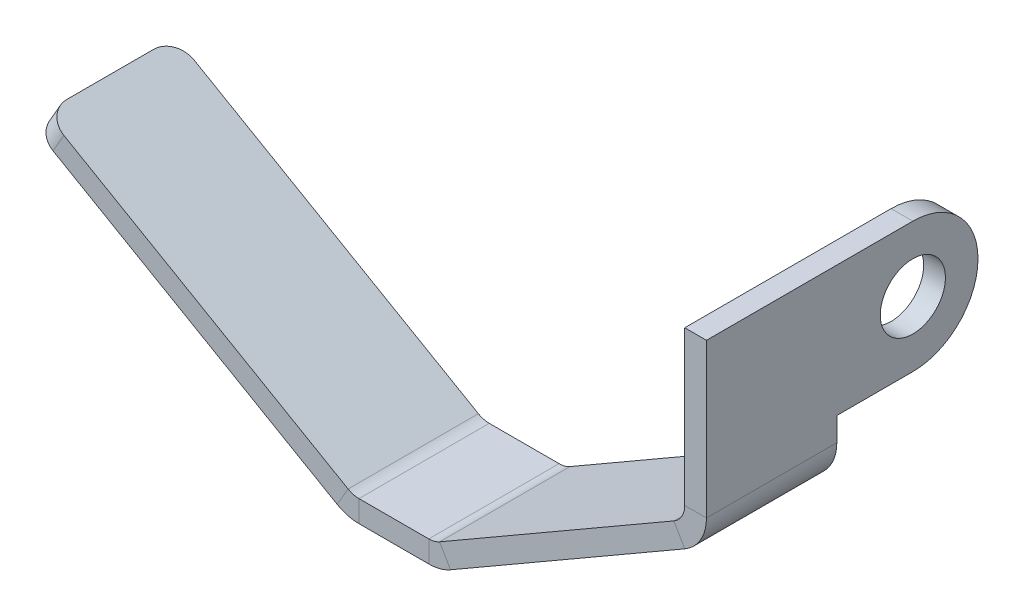
ISO-10303-21;
HEADER;
FILE_DESCRIPTION(('STEP AP214'),'2;1');
FILE_NAME('part.step','',(''),(''),'','','');
FILE_SCHEMA(('AUTOMOTIVE_DESIGN { 1 0 10303 214 1 1 1 1 }'));
ENDSEC;
DATA;
#1=APPLICATION_CONTEXT('core data for automotive mechanical design processes');
#2=APPLICATION_PROTOCOL_DEFINITION('international standard','automotive_design',2000,#1);
#3=PRODUCT_CONTEXT('',#1,'mechanical');
#4=PRODUCT('Part','Part','',(#3));
#5=PRODUCT_RELATED_PRODUCT_CATEGORY('part','',(#4));
#6=PRODUCT_DEFINITION_FORMATION('','',#4);
#7=PRODUCT_DEFINITION_CONTEXT('part definition',#1,'design');
#8=PRODUCT_DEFINITION('design','',#6,#7);
#9=PRODUCT_DEFINITION_SHAPE('','',#8);
#10=(LENGTH_UNIT() NAMED_UNIT(*) SI_UNIT(.MILLI.,.METRE.));
#11=(NAMED_UNIT(*) PLANE_ANGLE_UNIT() SI_UNIT($,.RADIAN.));
#12=(NAMED_UNIT(*) SI_UNIT($,.STERADIAN.) SOLID_ANGLE_UNIT());
#13=UNCERTAINTY_MEASURE_WITH_UNIT(LENGTH_MEASURE(1.E-05),#10,'distance_accuracy_value','');
#14=(GEOMETRIC_REPRESENTATION_CONTEXT(3) GLOBAL_UNCERTAINTY_ASSIGNED_CONTEXT((#13)) GLOBAL_UNIT_ASSIGNED_CONTEXT((#10,
#11,#12)) REPRESENTATION_CONTEXT('',''));
#15=CARTESIAN_POINT('',(0.,0.,0.));
#16=DIRECTION('',(0.,0.,1.));
#17=DIRECTION('',(1.,0.,0.));
#18=AXIS2_PLACEMENT_3D('',#15,#16,#17);
#19=CARTESIAN_POINT('',(0.303111922369607,-1.0623749446338,-6.));
#20=DIRECTION('',(0.,0.,-1.));
#21=DIRECTION('',(-0.866025403784438,-0.500000000000001,0.));
#22=AXIS2_PLACEMENT_3D('',#19,#20,#21);
#23=PLANE('',#22);
#24=DIRECTION('',(0.866025403784438,0.500000000000001,0.));
#25=VECTOR('',#24,1.);
#26=CARTESIAN_POINT('',(0.303111922369607,-1.0623749446338,-6.));
#27=LINE('',#26,#25);
#28=CARTESIAN_POINT('',(4.10730091830127,1.13397459621556,-6.));
#29=VERTEX_POINT('',#28);
#30=CARTESIAN_POINT('',(14.8915691904895,7.36027478617659,-6.));
#31=VERTEX_POINT('',#30);
#32=EDGE_CURVE('E267',#29,#31,#27,.T.);
#33=ORIENTED_EDGE('',*,*,#32,.T.);
#34=DIRECTION('',(0.500000000000001,-0.866025403784438,0.));
#35=VECTOR('',#34,1.);
#36=CARTESIAN_POINT('',(14.8915691904895,7.36027478617659,-6.));
#37=LINE('',#36,#35);
#38=CARTESIAN_POINT('',(15.3915691904895,6.49424938239215,-6.));
#39=VERTEX_POINT('',#38);
#40=EDGE_CURVE('E12',#31,#39,#37,.T.);
#41=ORIENTED_EDGE('',*,*,#40,.T.);
#42=DIRECTION('',(0.866025403784438,0.500000000000001,0.));
#43=VECTOR('',#42,1.);
#44=CARTESIAN_POINT('',(0.803111922369608,-1.92840034841824,-6.));
#45=LINE('',#44,#43);
#46=CARTESIAN_POINT('',(4.60730091830128,0.267949192431124,-6.));
#47=VERTEX_POINT('',#46);
#48=EDGE_CURVE('E248',#47,#39,#45,.T.);
#49=ORIENTED_EDGE('',*,*,#48,.F.);
#50=DIRECTION('',(0.500000000000001,-0.866025403784438,0.));
#51=VECTOR('',#50,1.);
#52=CARTESIAN_POINT('',(4.10730091830127,1.13397459621556,-6.));
#53=LINE('',#52,#51);
#54=EDGE_CURVE('E253',#29,#47,#53,.T.);
#55=ORIENTED_EDGE('',*,*,#54,.F.);
#56=EDGE_LOOP('',(#33,#41,#49,#55));
#57=FACE_BOUND('',#56,.T.);
#58=ADVANCED_FACE('F58',(#57),#23,.T.);
#59=CARTESIAN_POINT('',(0.303111922369607,-1.0623749446338,0.));
#60=DIRECTION('',(-0.500000000000001,0.866025403784438,0.));
#61=DIRECTION('',(0.,0.,1.));
#62=AXIS2_PLACEMENT_3D('',#59,#60,#61);
#63=PLANE('',#62);
#64=DIRECTION('',(0.866025403784438,0.500000000000001,0.));
#65=VECTOR('',#64,1.);
#66=CARTESIAN_POINT('',(0.303111922369607,-1.0623749446338,0.));
#67=LINE('',#66,#65);
#68=CARTESIAN_POINT('',(4.10730091830127,1.13397459621556,0.));
#69=VERTEX_POINT('',#68);
#70=CARTESIAN_POINT('',(14.8915691904895,7.36027478617659,0.));
#71=VERTEX_POINT('',#70);
#72=EDGE_CURVE('E61',#69,#71,#67,.T.);
#73=ORIENTED_EDGE('',*,*,#72,.T.);
#74=DIRECTION('',(0.,0.,-1.));
#75=VECTOR('',#74,1.);
#76=CARTESIAN_POINT('',(14.8915691904895,7.36027478617659,0.));
#77=LINE('',#76,#75);
#78=EDGE_CURVE('E345',#71,#31,#77,.T.);
#79=ORIENTED_EDGE('',*,*,#78,.T.);
#80=ORIENTED_EDGE('',*,*,#32,.F.);
#81=DIRECTION('',(0.,0.,-1.));
#82=VECTOR('',#81,1.);
#83=CARTESIAN_POINT('',(4.10730091830127,1.13397459621556,0.));
#84=LINE('',#83,#82);
#85=EDGE_CURVE('E241',#69,#29,#84,.T.);
#86=ORIENTED_EDGE('',*,*,#85,.F.);
#87=EDGE_LOOP('',(#73,#79,#80,#86));
#88=FACE_BOUND('',#87,.T.);
#89=ADVANCED_FACE('F383',(#88),#63,.T.);
#90=CARTESIAN_POINT('',(0.,1.,-6.));
#91=DIRECTION('',(0.,0.,-1.));
#92=DIRECTION('',(-1.,0.,0.));
#93=AXIS2_PLACEMENT_3D('',#90,#91,#92);
#94=PLANE('',#93);
#95=DIRECTION('',(1.,0.,0.));
#96=VECTOR('',#95,1.);
#97=CARTESIAN_POINT('',(0.,1.,-6.));
#98=LINE('',#97,#96);
#99=CARTESIAN_POINT('',(0.392699081698723,1.,-6.));
#100=VERTEX_POINT('',#99);
#101=CARTESIAN_POINT('',(3.60730091830127,1.,-6.));
#102=VERTEX_POINT('',#101);
#103=EDGE_CURVE('E346',#100,#102,#98,.T.);
#104=ORIENTED_EDGE('',*,*,#103,.T.);
#105=DIRECTION('',(0.,-1.,0.));
#106=VECTOR('',#105,1.);
#107=CARTESIAN_POINT('',(3.60730091830127,1.,-6.));
#108=LINE('',#107,#106);
#109=CARTESIAN_POINT('',(3.60730091830127,0.,-6.));
#110=VERTEX_POINT('',#109);
#111=EDGE_CURVE('E342',#102,#110,#108,.T.);
#112=ORIENTED_EDGE('',*,*,#111,.T.);
#113=DIRECTION('',(1.,0.,0.));
#114=VECTOR('',#113,1.);
#115=CARTESIAN_POINT('',(0.,0.,-6.));
#116=LINE('',#115,#114);
#117=CARTESIAN_POINT('',(0.392699081698723,0.,-6.));
#118=VERTEX_POINT('',#117);
#119=EDGE_CURVE('E320',#118,#110,#116,.T.);
#120=ORIENTED_EDGE('',*,*,#119,.F.);
#121=DIRECTION('',(0.,-1.,0.));
#122=VECTOR('',#121,1.);
#123=CARTESIAN_POINT('',(0.392699081698723,1.,-6.));
#124=LINE('',#123,#122);
#125=EDGE_CURVE('E326',#100,#118,#124,.T.);
#126=ORIENTED_EDGE('',*,*,#125,.F.);
#127=EDGE_LOOP('',(#104,#112,#120,#126));
#128=FACE_BOUND('',#127,.T.);
#129=ADVANCED_FACE('F399',(#128),#94,.T.);
#130=CARTESIAN_POINT('',(0.,1.,0.));
#131=DIRECTION('',(0.,1.,0.));
#132=DIRECTION('',(0.,0.,1.));
#133=AXIS2_PLACEMENT_3D('',#130,#131,#132);
#134=PLANE('',#133);
#135=DIRECTION('',(1.,0.,0.));
#136=VECTOR('',#135,1.);
#137=CARTESIAN_POINT('',(0.,1.,0.));
#138=LINE('',#137,#136);
#139=CARTESIAN_POINT('',(0.392699081698723,1.,0.));
#140=VERTEX_POINT('',#139);
#141=CARTESIAN_POINT('',(3.60730091830127,1.,0.));
#142=VERTEX_POINT('',#141);
#143=EDGE_CURVE('E327',#140,#142,#138,.T.);
#144=ORIENTED_EDGE('',*,*,#143,.T.);
#145=DIRECTION('',(0.,0.,-1.));
#146=VECTOR('',#145,1.);
#147=CARTESIAN_POINT('',(3.60730091830127,1.,0.));
#148=LINE('',#147,#146);
#149=EDGE_CURVE('E335',#142,#102,#148,.T.);
#150=ORIENTED_EDGE('',*,*,#149,.T.);
#151=ORIENTED_EDGE('',*,*,#103,.F.);
#152=DIRECTION('',(0.,0.,-1.));
#153=VECTOR('',#152,1.);
#154=CARTESIAN_POINT('',(0.392699081698723,1.,0.));
#155=LINE('',#154,#153);
#156=EDGE_CURVE('E324',#140,#100,#155,.T.);
#157=ORIENTED_EDGE('',*,*,#156,.F.);
#158=EDGE_LOOP('',(#144,#150,#151,#157));
#159=FACE_BOUND('',#158,.T.);
#160=ADVANCED_FACE('F393',(#159),#134,.T.);
#161=CARTESIAN_POINT('',(0.,0.,0.));
#162=DIRECTION('',(0.,1.,0.));
#163=DIRECTION('',(0.,0.,1.));
#164=AXIS2_PLACEMENT_3D('',#161,#162,#163);
#165=PLANE('',#164);
#166=DIRECTION('',(0.,0.,-1.));
#167=VECTOR('',#166,1.);
#168=CARTESIAN_POINT('',(3.60730091830127,0.,0.));
#169=LINE('',#168,#167);
#170=CARTESIAN_POINT('',(3.60730091830127,0.,0.));
#171=VERTEX_POINT('',#170);
#172=EDGE_CURVE('E340',#171,#110,#169,.T.);
#173=ORIENTED_EDGE('',*,*,#172,.F.);
#174=DIRECTION('',(1.,0.,0.));
#175=VECTOR('',#174,1.);
#176=CARTESIAN_POINT('',(0.,0.,0.));
#177=LINE('',#176,#175);
#178=CARTESIAN_POINT('',(0.392699081698723,0.,0.));
#179=VERTEX_POINT('',#178);
#180=EDGE_CURVE('E349',#179,#171,#177,.T.);
#181=ORIENTED_EDGE('',*,*,#180,.F.);
#182=DIRECTION('',(0.,0.,-1.));
#183=VECTOR('',#182,1.);
#184=CARTESIAN_POINT('',(0.392699081698723,0.,0.));
#185=LINE('',#184,#183);
#186=EDGE_CURVE('E329',#179,#118,#185,.T.);
#187=ORIENTED_EDGE('',*,*,#186,.T.);
#188=ORIENTED_EDGE('',*,*,#119,.T.);
#189=EDGE_LOOP('',(#173,#181,#187,#188));
#190=FACE_BOUND('',#189,.T.);
#191=ADVANCED_FACE('F438',(#190),#165,.F.);
#192=CARTESIAN_POINT('',(0.,1.,0.));
#193=DIRECTION('',(0.,0.,-1.));
#194=DIRECTION('',(-1.,0.,0.));
#195=AXIS2_PLACEMENT_3D('',#192,#193,#194);
#196=PLANE('',#195);
#197=DIRECTION('',(0.,-1.,0.));
#198=VECTOR('',#197,1.);
#199=CARTESIAN_POINT('',(3.60730091830127,1.,0.));
#200=LINE('',#199,#198);
#201=EDGE_CURVE('E338',#142,#171,#200,.T.);
#202=ORIENTED_EDGE('',*,*,#201,.F.);
#203=ORIENTED_EDGE('',*,*,#143,.F.);
#204=DIRECTION('',(0.,-1.,0.));
#205=VECTOR('',#204,1.);
#206=CARTESIAN_POINT('',(0.392699081698723,1.,0.));
#207=LINE('',#206,#205);
#208=EDGE_CURVE('E332',#140,#179,#207,.T.);
#209=ORIENTED_EDGE('',*,*,#208,.T.);
#210=ORIENTED_EDGE('',*,*,#180,.T.);
#211=EDGE_LOOP('',(#202,#203,#209,#210));
#212=FACE_BOUND('',#211,.T.);
#213=ADVANCED_FACE('F433',(#212),#196,.F.);
#214=CARTESIAN_POINT('',(0.392699081698723,2.,0.));
#215=DIRECTION('',(0.,0.,-1.));
#216=DIRECTION('',(-1.,0.,0.));
#217=AXIS2_PLACEMENT_3D('',#214,#215,#216);
#218=PLANE('',#217);
#219=DIRECTION('',(-0.500000000000001,-0.866025403784438,0.));
#220=VECTOR('',#219,1.);
#221=CARTESIAN_POINT('',(-0.107300918301278,1.13397459621556,0.));
#222=LINE('',#221,#220);
#223=CARTESIAN_POINT('',(-0.107300918301278,1.13397459621556,0.));
#224=VERTEX_POINT('',#223);
#225=CARTESIAN_POINT('',(-0.607300918301279,0.267949192431124,0.));
#226=VERTEX_POINT('',#225);
#227=EDGE_CURVE('E263',#224,#226,#222,.T.);
#228=ORIENTED_EDGE('',*,*,#227,.T.);
#229=CARTESIAN_POINT('',(0.392699081698723,2.,0.));
#230=DIRECTION('',(0.,0.,1.));
#231=DIRECTION('',(1.,0.,0.));
#232=AXIS2_PLACEMENT_3D('',#229,#230,#231);
#233=CIRCLE('',#232,2.);
#234=EDGE_CURVE('E271',#226,#179,#233,.T.);
#235=ORIENTED_EDGE('',*,*,#234,.T.);
#236=ORIENTED_EDGE('',*,*,#208,.F.);
#237=CARTESIAN_POINT('',(0.392699081698723,2.,0.));
#238=DIRECTION('',(0.,0.,1.));
#239=DIRECTION('',(1.,0.,0.));
#240=AXIS2_PLACEMENT_3D('',#237,#238,#239);
#241=CIRCLE('',#240,1.);
#242=EDGE_CURVE('E313',#224,#140,#241,.T.);
#243=ORIENTED_EDGE('',*,*,#242,.F.);
#244=EDGE_LOOP('',(#228,#235,#236,#243));
#245=FACE_BOUND('',#244,.T.);
#246=ADVANCED_FACE('F420',(#245),#218,.F.);
#247=CARTESIAN_POINT('',(0.392699081698723,2.,-6.));
#248=DIRECTION('',(0.,0.,1.));
#249=DIRECTION('',(1.,0.,0.));
#250=AXIS2_PLACEMENT_3D('',#247,#248,#249);
#251=PLANE('',#250);
#252=CARTESIAN_POINT('',(0.392699081698723,2.,-6.));
#253=DIRECTION('',(0.,0.,1.));
#254=DIRECTION('',(1.,0.,0.));
#255=AXIS2_PLACEMENT_3D('',#252,#253,#254);
#256=CIRCLE('',#255,2.);
#257=CARTESIAN_POINT('',(-0.607300918301279,0.267949192431124,-6.));
#258=VERTEX_POINT('',#257);
#259=EDGE_CURVE('E317',#118,#258,#256,.F.);
#260=ORIENTED_EDGE('',*,*,#259,.T.);
#261=DIRECTION('',(-0.500000000000001,-0.866025403784438,0.));
#262=VECTOR('',#261,1.);
#263=CARTESIAN_POINT('',(-0.107300918301278,1.13397459621556,-6.));
#264=LINE('',#263,#262);
#265=CARTESIAN_POINT('',(-0.107300918301278,1.13397459621556,-6.));
#266=VERTEX_POINT('',#265);
#267=EDGE_CURVE('E277',#266,#258,#264,.T.);
#268=ORIENTED_EDGE('',*,*,#267,.F.);
#269=CARTESIAN_POINT('',(0.392699081698723,2.,-6.));
#270=DIRECTION('',(0.,0.,-1.));
#271=DIRECTION('',(1.,0.,0.));
#272=AXIS2_PLACEMENT_3D('',#269,#270,#271);
#273=CIRCLE('',#272,1.);
#274=EDGE_CURVE('E316',#100,#266,#273,.T.);
#275=ORIENTED_EDGE('',*,*,#274,.F.);
#276=ORIENTED_EDGE('',*,*,#125,.T.);
#277=EDGE_LOOP('',(#260,#268,#275,#276));
#278=FACE_BOUND('',#277,.T.);
#279=ADVANCED_FACE('F404',(#278),#251,.F.);
#280=CARTESIAN_POINT('',(0.392699081698723,2.,-9.13325772123332));
#281=DIRECTION('',(0.,0.,1.));
#282=DIRECTION('',(1.,0.,0.));
#283=AXIS2_PLACEMENT_3D('',#280,#281,#282);
#284=CYLINDRICAL_SURFACE('',#283,1.);
#285=ORIENTED_EDGE('',*,*,#156,.T.);
#286=ORIENTED_EDGE('',*,*,#274,.T.);
#287=DIRECTION('',(0.,0.,-1.));
#288=VECTOR('',#287,1.);
#289=CARTESIAN_POINT('',(-0.107300918301278,1.13397459621556,0.));
#290=LINE('',#289,#288);
#291=EDGE_CURVE('E289',#224,#266,#290,.T.);
#292=ORIENTED_EDGE('',*,*,#291,.F.);
#293=ORIENTED_EDGE('',*,*,#242,.T.);
#294=EDGE_LOOP('',(#285,#286,#292,#293));
#295=FACE_BOUND('',#294,.T.);
#296=ADVANCED_FACE('F431',(#295),#284,.F.);
#297=CARTESIAN_POINT('',(0.392699081698723,2.,-9.13325772123332));
#298=DIRECTION('',(0.,0.,1.));
#299=DIRECTION('',(1.,0.,0.));
#300=AXIS2_PLACEMENT_3D('',#297,#298,#299);
#301=CYLINDRICAL_SURFACE('',#300,2.);
#302=ORIENTED_EDGE('',*,*,#186,.F.);
#303=ORIENTED_EDGE('',*,*,#234,.F.);
#304=DIRECTION('',(0.,0.,-1.));
#305=VECTOR('',#304,1.);
#306=CARTESIAN_POINT('',(-0.607300918301279,0.267949192431124,0.));
#307=LINE('',#306,#305);
#308=EDGE_CURVE('E308',#226,#258,#307,.T.);
#309=ORIENTED_EDGE('',*,*,#308,.T.);
#310=ORIENTED_EDGE('',*,*,#259,.F.);
#311=EDGE_LOOP('',(#302,#303,#309,#310));
#312=FACE_BOUND('',#311,.T.);
#313=ADVANCED_FACE('F408',(#312),#301,.T.);
#314=CARTESIAN_POINT('',(-13.1906072961661,8.68762505536621,-1.));
#315=DIRECTION('',(-0.500000000000001,-0.866025403784438,0.));
#316=DIRECTION('',(0.,0.,-1.));
#317=AXIS2_PLACEMENT_3D('',#314,#315,#316);
#318=CYLINDRICAL_SURFACE('',#317,1.);
#319=CARTESIAN_POINT('',(-13.6906072961661,7.82159965158178,-1.));
#320=DIRECTION('',(0.500000000000001,0.866025403784438,0.));
#321=DIRECTION('',(0.,0.,1.));
#322=AXIS2_PLACEMENT_3D('',#319,#320,#321);
#323=CIRCLE('',#322,1.);
#324=CARTESIAN_POINT('',(-14.5566326999506,8.32159965158178,-1.));
#325=VERTEX_POINT('',#324);
#326=CARTESIAN_POINT('',(-13.6906072961661,7.82159965158178,0.));
#327=VERTEX_POINT('',#326);
#328=EDGE_CURVE('E306',#325,#327,#323,.T.);
#329=ORIENTED_EDGE('',*,*,#328,.T.);
#330=DIRECTION('',(-0.500000000000001,-0.866025403784438,0.));
#331=VECTOR('',#330,1.);
#332=CARTESIAN_POINT('',(-13.1906072961661,8.68762505536621,0.));
#333=LINE('',#332,#331);
#334=CARTESIAN_POINT('',(-13.1906072961661,8.68762505536621,0.));
#335=VERTEX_POINT('',#334);
#336=EDGE_CURVE('E272',#335,#327,#333,.T.);
#337=ORIENTED_EDGE('',*,*,#336,.F.);
#338=CARTESIAN_POINT('',(-13.1906072961661,8.68762505536621,-1.));
#339=DIRECTION('',(0.500000000000001,0.866025403784438,0.));
#340=DIRECTION('',(0.,0.,1.));
#341=AXIS2_PLACEMENT_3D('',#338,#339,#340);
#342=CIRCLE('',#341,1.);
#343=CARTESIAN_POINT('',(-14.0566326999506,9.18762505536622,-1.));
#344=VERTEX_POINT('',#343);
#345=EDGE_CURVE('E283',#344,#335,#342,.T.);
#346=ORIENTED_EDGE('',*,*,#345,.F.);
#347=DIRECTION('',(-0.500000000000001,-0.866025403784438,0.));
#348=VECTOR('',#347,1.);
#349=CARTESIAN_POINT('',(-14.0566326999506,9.18762505536622,-1.));
#350=LINE('',#349,#348);
#351=EDGE_CURVE('E303',#344,#325,#350,.T.);
#352=ORIENTED_EDGE('',*,*,#351,.T.);
#353=EDGE_LOOP('',(#329,#337,#346,#352));
#354=FACE_BOUND('',#353,.T.);
#355=ADVANCED_FACE('F480',(#354),#318,.T.);
#356=CARTESIAN_POINT('',(-14.0566326999506,9.18762505536622,0.));
#357=DIRECTION('',(0.866025403784438,-0.500000000000001,0.));
#358=DIRECTION('',(0.,0.,-1.));
#359=AXIS2_PLACEMENT_3D('',#356,#357,#358);
#360=PLANE('',#359);
#361=DIRECTION('',(0.,0.,1.));
#362=VECTOR('',#361,1.);
#363=CARTESIAN_POINT('',(-14.5566326999506,8.32159965158178,0.));
#364=LINE('',#363,#362);
#365=CARTESIAN_POINT('',(-14.5566326999506,8.32159965158178,-5.));
#366=VERTEX_POINT('',#365);
#367=EDGE_CURVE('E301',#366,#325,#364,.T.);
#368=ORIENTED_EDGE('',*,*,#367,.T.);
#369=ORIENTED_EDGE('',*,*,#351,.F.);
#370=DIRECTION('',(0.,0.,1.));
#371=VECTOR('',#370,1.);
#372=CARTESIAN_POINT('',(-14.0566326999506,9.18762505536622,0.));
#373=LINE('',#372,#371);
#374=CARTESIAN_POINT('',(-14.0566326999506,9.18762505536622,-5.));
#375=VERTEX_POINT('',#374);
#376=EDGE_CURVE('E285',#375,#344,#373,.T.);
#377=ORIENTED_EDGE('',*,*,#376,.F.);
#378=DIRECTION('',(-0.500000000000001,-0.866025403784438,0.));
#379=VECTOR('',#378,1.);
#380=CARTESIAN_POINT('',(-14.0566326999506,9.18762505536622,-5.));
#381=LINE('',#380,#379);
#382=EDGE_CURVE('E298',#375,#366,#381,.T.);
#383=ORIENTED_EDGE('',*,*,#382,.T.);
#384=EDGE_LOOP('',(#368,#369,#377,#383));
#385=FACE_BOUND('',#384,.T.);
#386=ADVANCED_FACE('F483',(#385),#360,.F.);
#387=CARTESIAN_POINT('',(-13.1906072961661,8.68762505536621,-5.));
#388=DIRECTION('',(-0.500000000000001,-0.866025403784438,0.));
#389=DIRECTION('',(0.,0.,-1.));
#390=AXIS2_PLACEMENT_3D('',#387,#388,#389);
#391=CYLINDRICAL_SURFACE('',#390,1.);
#392=CARTESIAN_POINT('',(-13.6906072961661,7.82159965158178,-5.));
#393=DIRECTION('',(0.500000000000001,0.866025403784438,0.));
#394=DIRECTION('',(0.,0.,1.));
#395=AXIS2_PLACEMENT_3D('',#392,#393,#394);
#396=CIRCLE('',#395,1.);
#397=CARTESIAN_POINT('',(-13.6906072961661,7.82159965158178,-6.));
#398=VERTEX_POINT('',#397);
#399=EDGE_CURVE('E296',#398,#366,#396,.T.);
#400=ORIENTED_EDGE('',*,*,#399,.T.);
#401=ORIENTED_EDGE('',*,*,#382,.F.);
#402=CARTESIAN_POINT('',(-13.1906072961661,8.68762505536621,-5.));
#403=DIRECTION('',(0.500000000000001,0.866025403784438,0.));
#404=DIRECTION('',(0.,0.,1.));
#405=AXIS2_PLACEMENT_3D('',#402,#403,#404);
#406=CIRCLE('',#405,1.);
#407=CARTESIAN_POINT('',(-13.1906072961661,8.68762505536621,-6.));
#408=VERTEX_POINT('',#407);
#409=EDGE_CURVE('E287',#408,#375,#406,.T.);
#410=ORIENTED_EDGE('',*,*,#409,.F.);
#411=DIRECTION('',(-0.500000000000001,-0.866025403784438,0.));
#412=VECTOR('',#411,1.);
#413=CARTESIAN_POINT('',(-13.1906072961661,8.68762505536621,-6.));
#414=LINE('',#413,#412);
#415=EDGE_CURVE('E294',#408,#398,#414,.T.);
#416=ORIENTED_EDGE('',*,*,#415,.T.);
#417=EDGE_LOOP('',(#400,#401,#410,#416));
#418=FACE_BOUND('',#417,.T.);
#419=ADVANCED_FACE('F487',(#418),#391,.T.);
#420=CARTESIAN_POINT('',(0.23278646249264,0.937625055366198,0.));
#421=DIRECTION('',(0.500000000000001,0.866025403784438,0.));
#422=DIRECTION('',(0.,0.,1.));
#423=AXIS2_PLACEMENT_3D('',#420,#421,#422);
#424=PLANE('',#423);
#425=DIRECTION('',(0.866025403784438,-0.500000000000001,0.));
#426=VECTOR('',#425,1.);
#427=CARTESIAN_POINT('',(0.23278646249264,0.937625055366198,0.));
#428=LINE('',#427,#426);
#429=EDGE_CURVE('E291',#335,#224,#428,.T.);
#430=ORIENTED_EDGE('',*,*,#429,.T.);
#431=ORIENTED_EDGE('',*,*,#291,.T.);
#432=DIRECTION('',(0.866025403784438,-0.500000000000001,0.));
#433=VECTOR('',#432,1.);
#434=CARTESIAN_POINT('',(0.23278646249264,0.937625055366198,-6.));
#435=LINE('',#434,#433);
#436=EDGE_CURVE('E280',#408,#266,#435,.T.);
#437=ORIENTED_EDGE('',*,*,#436,.F.);
#438=ORIENTED_EDGE('',*,*,#409,.T.);
#439=ORIENTED_EDGE('',*,*,#376,.T.);
#440=ORIENTED_EDGE('',*,*,#345,.T.);
#441=EDGE_LOOP('',(#430,#431,#437,#438,#439,#440));
#442=FACE_BOUND('',#441,.T.);
#443=ADVANCED_FACE('F426',(#442),#424,.T.);
#444=CARTESIAN_POINT('',(0.23278646249264,0.937625055366198,-6.));
#445=DIRECTION('',(0.,0.,-1.));
#446=DIRECTION('',(-0.866025403784438,0.500000000000001,0.));
#447=AXIS2_PLACEMENT_3D('',#444,#445,#446);
#448=PLANE('',#447);
#449=ORIENTED_EDGE('',*,*,#436,.T.);
#450=ORIENTED_EDGE('',*,*,#267,.T.);
#451=DIRECTION('',(0.866025403784438,-0.500000000000001,0.));
#452=VECTOR('',#451,1.);
#453=CARTESIAN_POINT('',(-0.267213537507361,0.0715996515817602,-6.));
#454=LINE('',#453,#452);
#455=EDGE_CURVE('E275',#398,#258,#454,.T.);
#456=ORIENTED_EDGE('',*,*,#455,.F.);
#457=ORIENTED_EDGE('',*,*,#415,.F.);
#458=EDGE_LOOP('',(#449,#450,#456,#457));
#459=FACE_BOUND('',#458,.T.);
#460=ADVANCED_FACE('F494',(#459),#448,.T.);
#461=CARTESIAN_POINT('',(-0.267213537507361,0.0715996515817602,0.));
#462=DIRECTION('',(0.500000000000001,0.866025403784438,0.));
#463=DIRECTION('',(0.,0.,1.));
#464=AXIS2_PLACEMENT_3D('',#461,#462,#463);
#465=PLANE('',#464);
#466=ORIENTED_EDGE('',*,*,#308,.F.);
#467=DIRECTION('',(0.866025403784438,-0.500000000000001,0.));
#468=VECTOR('',#467,1.);
#469=CARTESIAN_POINT('',(-0.267213537507361,0.0715996515817602,0.));
#470=LINE('',#469,#468);
#471=EDGE_CURVE('E269',#327,#226,#470,.T.);
#472=ORIENTED_EDGE('',*,*,#471,.F.);
#473=ORIENTED_EDGE('',*,*,#328,.F.);
#474=ORIENTED_EDGE('',*,*,#367,.F.);
#475=ORIENTED_EDGE('',*,*,#399,.F.);
#476=ORIENTED_EDGE('',*,*,#455,.T.);
#477=EDGE_LOOP('',(#466,#472,#473,#474,#475,#476));
#478=FACE_BOUND('',#477,.T.);
#479=ADVANCED_FACE('F414',(#478),#465,.F.);
#480=CARTESIAN_POINT('',(0.23278646249264,0.937625055366198,0.));
#481=DIRECTION('',(0.,0.,-1.));
#482=DIRECTION('',(-0.866025403784438,0.500000000000001,0.));
#483=AXIS2_PLACEMENT_3D('',#480,#481,#482);
#484=PLANE('',#483);
#485=ORIENTED_EDGE('',*,*,#227,.F.);
#486=ORIENTED_EDGE('',*,*,#429,.F.);
#487=ORIENTED_EDGE('',*,*,#336,.T.);
#488=ORIENTED_EDGE('',*,*,#471,.T.);
#489=EDGE_LOOP('',(#485,#486,#487,#488));
#490=FACE_BOUND('',#489,.T.);
#491=ADVANCED_FACE('F423',(#490),#484,.F.);
#492=CARTESIAN_POINT('',(3.60730091830127,2.,0.));
#493=DIRECTION('',(0.,0.,-1.));
#494=DIRECTION('',(-1.,0.,0.));
#495=AXIS2_PLACEMENT_3D('',#492,#493,#494);
#496=PLANE('',#495);
#497=ORIENTED_EDGE('',*,*,#201,.T.);
#498=CARTESIAN_POINT('',(3.60730091830127,2.,0.));
#499=DIRECTION('',(0.,0.,-1.));
#500=DIRECTION('',(-1.,0.,0.));
#501=AXIS2_PLACEMENT_3D('',#498,#499,#500);
#502=CIRCLE('',#501,2.);
#503=CARTESIAN_POINT('',(4.60730091830128,0.267949192431124,0.));
#504=VERTEX_POINT('',#503);
#505=EDGE_CURVE('E264',#171,#504,#502,.F.);
#506=ORIENTED_EDGE('',*,*,#505,.T.);
#507=DIRECTION('',(0.500000000000001,-0.866025403784438,0.));
#508=VECTOR('',#507,1.);
#509=CARTESIAN_POINT('',(4.10730091830127,1.13397459621556,0.));
#510=LINE('',#509,#508);
#511=EDGE_CURVE('E250',#69,#504,#510,.T.);
#512=ORIENTED_EDGE('',*,*,#511,.F.);
#513=CARTESIAN_POINT('',(3.60730091830127,2.,0.));
#514=DIRECTION('',(0.,0.,1.));
#515=DIRECTION('',(1.,0.,0.));
#516=AXIS2_PLACEMENT_3D('',#513,#514,#515);
#517=CIRCLE('',#516,1.);
#518=EDGE_CURVE('E257',#142,#69,#517,.T.);
#519=ORIENTED_EDGE('',*,*,#518,.F.);
#520=EDGE_LOOP('',(#497,#506,#512,#519));
#521=FACE_BOUND('',#520,.T.);
#522=ADVANCED_FACE('F386',(#521),#496,.F.);
#523=CARTESIAN_POINT('',(3.60730091830127,2.,-6.));
#524=DIRECTION('',(0.,0.,1.));
#525=DIRECTION('',(1.,0.,0.));
#526=AXIS2_PLACEMENT_3D('',#523,#524,#525);
#527=PLANE('',#526);
#528=CARTESIAN_POINT('',(3.60730091830127,2.,-6.));
#529=DIRECTION('',(0.,0.,-1.));
#530=DIRECTION('',(-1.,0.,0.));
#531=AXIS2_PLACEMENT_3D('',#528,#529,#530);
#532=CIRCLE('',#531,2.);
#533=EDGE_CURVE('E81',#47,#110,#532,.T.);
#534=ORIENTED_EDGE('',*,*,#533,.T.);
#535=ORIENTED_EDGE('',*,*,#111,.F.);
#536=CARTESIAN_POINT('',(3.60730091830127,2.,-6.));
#537=DIRECTION('',(0.,0.,-1.));
#538=DIRECTION('',(1.,0.,0.));
#539=AXIS2_PLACEMENT_3D('',#536,#537,#538);
#540=CIRCLE('',#539,1.);
#541=EDGE_CURVE('E260',#29,#102,#540,.T.);
#542=ORIENTED_EDGE('',*,*,#541,.F.);
#543=ORIENTED_EDGE('',*,*,#54,.T.);
#544=EDGE_LOOP('',(#534,#535,#542,#543));
#545=FACE_BOUND('',#544,.T.);
#546=ADVANCED_FACE('F474',(#545),#527,.F.);
#547=CARTESIAN_POINT('',(3.60730091830127,2.,3.13325772123332));
#548=DIRECTION('',(0.,0.,-1.));
#549=DIRECTION('',(-1.,0.,0.));
#550=AXIS2_PLACEMENT_3D('',#547,#548,#549);
#551=CYLINDRICAL_SURFACE('',#550,1.);
#552=ORIENTED_EDGE('',*,*,#85,.T.);
#553=ORIENTED_EDGE('',*,*,#541,.T.);
#554=ORIENTED_EDGE('',*,*,#149,.F.);
#555=ORIENTED_EDGE('',*,*,#518,.T.);
#556=EDGE_LOOP('',(#552,#553,#554,#555));
#557=FACE_BOUND('',#556,.T.);
#558=ADVANCED_FACE('F389',(#557),#551,.F.);
#559=CARTESIAN_POINT('',(3.60730091830127,2.,3.13325772123332));
#560=DIRECTION('',(0.,0.,-1.));
#561=DIRECTION('',(-1.,0.,0.));
#562=AXIS2_PLACEMENT_3D('',#559,#560,#561);
#563=CYLINDRICAL_SURFACE('',#562,2.);
#564=DIRECTION('',(0.,0.,-1.));
#565=VECTOR('',#564,1.);
#566=CARTESIAN_POINT('',(4.60730091830128,0.267949192431124,0.));
#567=LINE('',#566,#565);
#568=EDGE_CURVE('E245',#504,#47,#567,.T.);
#569=ORIENTED_EDGE('',*,*,#568,.F.);
#570=ORIENTED_EDGE('',*,*,#505,.F.);
#571=ORIENTED_EDGE('',*,*,#172,.T.);
#572=ORIENTED_EDGE('',*,*,#533,.F.);
#573=EDGE_LOOP('',(#569,#570,#571,#572));
#574=FACE_BOUND('',#573,.T.);
#575=ADVANCED_FACE('F436',(#574),#563,.T.);
#576=CARTESIAN_POINT('',(0.303111922369607,-1.0623749446338,0.));
#577=DIRECTION('',(0.,0.,-1.));
#578=DIRECTION('',(-0.866025403784438,-0.500000000000001,0.));
#579=AXIS2_PLACEMENT_3D('',#576,#577,#578);
#580=PLANE('',#579);
#581=DIRECTION('',(0.500000000000001,-0.866025403784438,0.));
#582=VECTOR('',#581,1.);
#583=CARTESIAN_POINT('',(14.8915691904895,7.36027478617659,0.));
#584=LINE('',#583,#582);
#585=CARTESIAN_POINT('',(15.3915691904895,6.49424938239215,0.));
#586=VERTEX_POINT('',#585);
#587=EDGE_CURVE('E358',#71,#586,#584,.T.);
#588=ORIENTED_EDGE('',*,*,#587,.F.);
#589=ORIENTED_EDGE('',*,*,#72,.F.);
#590=ORIENTED_EDGE('',*,*,#511,.T.);
#591=DIRECTION('',(0.866025403784438,0.500000000000001,0.));
#592=VECTOR('',#591,1.);
#593=CARTESIAN_POINT('',(0.803111922369608,-1.92840034841824,0.));
#594=LINE('',#593,#592);
#595=EDGE_CURVE('E249',#504,#586,#594,.T.);
#596=ORIENTED_EDGE('',*,*,#595,.T.);
#597=EDGE_LOOP('',(#588,#589,#590,#596));
#598=FACE_BOUND('',#597,.T.);
#599=ADVANCED_FACE('F367',(#598),#580,.F.);
#600=CARTESIAN_POINT('',(0.803111922369608,-1.92840034841824,0.));
#601=DIRECTION('',(-0.500000000000001,0.866025403784438,0.));
#602=DIRECTION('',(0.,0.,1.));
#603=AXIS2_PLACEMENT_3D('',#600,#601,#602);
#604=PLANE('',#603);
#605=DIRECTION('',(0.,0.,-1.));
#606=VECTOR('',#605,1.);
#607=CARTESIAN_POINT('',(15.3915691904895,6.49424938239215,0.));
#608=LINE('',#607,#606);
#609=EDGE_CURVE('E66',#586,#39,#608,.T.);
#610=ORIENTED_EDGE('',*,*,#609,.F.);
#611=ORIENTED_EDGE('',*,*,#595,.F.);
#612=ORIENTED_EDGE('',*,*,#568,.T.);
#613=ORIENTED_EDGE('',*,*,#48,.T.);
#614=EDGE_LOOP('',(#610,#611,#612,#613));
#615=FACE_BOUND('',#614,.T.);
#616=ADVANCED_FACE('F372',(#615),#604,.F.);
#617=CARTESIAN_POINT('',(14.3915691904895,8.22630018996102,0.));
#618=DIRECTION('',(0.,0.,-1.));
#619=DIRECTION('',(-1.,0.,0.));
#620=AXIS2_PLACEMENT_3D('',#617,#618,#619);
#621=PLANE('',#620);
#622=ORIENTED_EDGE('',*,*,#587,.T.);
#623=CARTESIAN_POINT('',(14.3915691904895,8.22630018996102,0.));
#624=DIRECTION('',(0.,0.,-1.));
#625=DIRECTION('',(-1.,0.,0.));
#626=AXIS2_PLACEMENT_3D('',#623,#624,#625);
#627=CIRCLE('',#626,2.);
#628=CARTESIAN_POINT('',(16.3915691904895,8.22630018996103,0.));
#629=VERTEX_POINT('',#628);
#630=EDGE_CURVE('E215',#586,#629,#627,.F.);
#631=ORIENTED_EDGE('',*,*,#630,.T.);
#632=DIRECTION('',(1.,0.,0.));
#633=VECTOR('',#632,1.);
#634=CARTESIAN_POINT('',(15.3915691904895,8.22630018996103,0.));
#635=LINE('',#634,#633);
#636=CARTESIAN_POINT('',(15.3915691904895,8.22630018996103,0.));
#637=VERTEX_POINT('',#636);
#638=EDGE_CURVE('E736',#637,#629,#635,.T.);
#639=ORIENTED_EDGE('',*,*,#638,.F.);
#640=CARTESIAN_POINT('',(14.3915691904895,8.22630018996102,0.));
#641=DIRECTION('',(0.,0.,1.));
#642=DIRECTION('',(1.,0.,0.));
#643=AXIS2_PLACEMENT_3D('',#640,#641,#642);
#644=CIRCLE('',#643,1.);
#645=EDGE_CURVE('E234',#71,#637,#644,.T.);
#646=ORIENTED_EDGE('',*,*,#645,.F.);
#647=EDGE_LOOP('',(#622,#631,#639,#646));
#648=FACE_BOUND('',#647,.T.);
#649=ADVANCED_FACE('F460',(#648),#621,.F.);
#650=CARTESIAN_POINT('',(14.3915691904895,8.22630018996102,-6.));
#651=DIRECTION('',(0.,0.,1.));
#652=DIRECTION('',(1.,0.,0.));
#653=AXIS2_PLACEMENT_3D('',#650,#651,#652);
#654=PLANE('',#653);
#655=DIRECTION('',(1.,0.,0.));
#656=VECTOR('',#655,1.);
#657=CARTESIAN_POINT('',(15.3915691904895,8.22630018996103,-6.));
#658=LINE('',#657,#656);
#659=CARTESIAN_POINT('',(15.3915691904895,8.22630018996103,-6.));
#660=VERTEX_POINT('',#659);
#661=CARTESIAN_POINT('',(16.3915691904895,8.22630018996103,-6.));
#662=VERTEX_POINT('',#661);
#663=EDGE_CURVE('E204',#660,#662,#658,.T.);
#664=ORIENTED_EDGE('',*,*,#663,.T.);
#665=CARTESIAN_POINT('',(14.3915691904895,8.22630018996102,-6.));
#666=DIRECTION('',(0.,0.,-1.));
#667=DIRECTION('',(-1.,0.,0.));
#668=AXIS2_PLACEMENT_3D('',#665,#666,#667);
#669=CIRCLE('',#668,2.);
#670=EDGE_CURVE('E238',#662,#39,#669,.T.);
#671=ORIENTED_EDGE('',*,*,#670,.T.);
#672=ORIENTED_EDGE('',*,*,#40,.F.);
#673=CARTESIAN_POINT('',(14.3915691904895,8.22630018996102,-6.));
#674=DIRECTION('',(0.,0.,-1.));
#675=DIRECTION('',(1.,0.,0.));
#676=AXIS2_PLACEMENT_3D('',#673,#674,#675);
#677=CIRCLE('',#676,1.);
#678=EDGE_CURVE('E237',#660,#31,#677,.T.);
#679=ORIENTED_EDGE('',*,*,#678,.F.);
#680=EDGE_LOOP('',(#664,#671,#672,#679));
#681=FACE_BOUND('',#680,.T.);
#682=ADVANCED_FACE('F377',(#681),#654,.F.);
#683=CARTESIAN_POINT('',(14.3915691904895,8.22630018996102,3.49523672752762));
#684=DIRECTION('',(0.,0.,-1.));
#685=DIRECTION('',(-1.,0.,0.));
#686=AXIS2_PLACEMENT_3D('',#683,#684,#685);
#687=CYLINDRICAL_SURFACE('',#686,1.);
#688=ORIENTED_EDGE('',*,*,#678,.T.);
#689=ORIENTED_EDGE('',*,*,#78,.F.);
#690=ORIENTED_EDGE('',*,*,#645,.T.);
#691=DIRECTION('',(0.,0.,-1.));
#692=VECTOR('',#691,1.);
#693=CARTESIAN_POINT('',(15.3915691904895,8.22630018996103,0.));
#694=LINE('',#693,#692);
#695=EDGE_CURVE('E232',#637,#660,#694,.T.);
#696=ORIENTED_EDGE('',*,*,#695,.T.);
#697=EDGE_LOOP('',(#688,#689,#690,#696));
#698=FACE_BOUND('',#697,.T.);
#699=ADVANCED_FACE('F380',(#698),#687,.F.);
#700=CARTESIAN_POINT('',(14.3915691904895,8.22630018996102,3.49523672752762));
#701=DIRECTION('',(0.,0.,-1.));
#702=DIRECTION('',(-1.,0.,0.));
#703=AXIS2_PLACEMENT_3D('',#700,#701,#702);
#704=CYLINDRICAL_SURFACE('',#703,2.);
#705=ORIENTED_EDGE('',*,*,#670,.F.);
#706=DIRECTION('',(0.,0.,-1.));
#707=VECTOR('',#706,1.);
#708=CARTESIAN_POINT('',(16.3915691904895,8.22630018996103,0.));
#709=LINE('',#708,#707);
#710=EDGE_CURVE('E729',#629,#662,#709,.T.);
#711=ORIENTED_EDGE('',*,*,#710,.F.);
#712=ORIENTED_EDGE('',*,*,#630,.F.);
#713=ORIENTED_EDGE('',*,*,#609,.T.);
#714=EDGE_LOOP('',(#705,#711,#712,#713));
#715=FACE_BOUND('',#714,.T.);
#716=ADVANCED_FACE('F606',(#715),#704,.T.);
#717=CARTESIAN_POINT('',(15.3915691904895,12.3102044015454,-9.5));
#718=DIRECTION('',(1.,0.,0.));
#719=DIRECTION('',(0.,0.,-1.));
#720=AXIS2_PLACEMENT_3D('',#717,#718,#719);
#721=CYLINDRICAL_SURFACE('',#720,1.5);
#722=CARTESIAN_POINT('',(15.3915691904895,12.3102044015454,-9.5));
#723=DIRECTION('',(-1.,0.,0.));
#724=DIRECTION('',(0.,0.,1.));
#725=AXIS2_PLACEMENT_3D('',#722,#723,#724);
#726=CIRCLE('',#725,1.5);
#727=CARTESIAN_POINT('',(15.3915691904895,12.3102044015454,-8.));
#728=VERTEX_POINT('',#727);
#729=EDGE_CURVE('E223',#728,#728,#726,.T.);
#730=ORIENTED_EDGE('',*,*,#729,.T.);
#731=EDGE_LOOP('',(#730));
#732=FACE_BOUND('',#731,.T.);
#733=CARTESIAN_POINT('',(16.3915691904895,12.3102044015454,-9.5));
#734=DIRECTION('',(-1.,0.,0.));
#735=DIRECTION('',(0.,0.,1.));
#736=AXIS2_PLACEMENT_3D('',#733,#734,#735);
#737=CIRCLE('',#736,1.5);
#738=CARTESIAN_POINT('',(16.3915691904895,12.3102044015454,-8.));
#739=VERTEX_POINT('',#738);
#740=EDGE_CURVE('E732',#739,#739,#737,.T.);
#741=ORIENTED_EDGE('',*,*,#740,.F.);
#742=EDGE_LOOP('',(#741));
#743=FACE_BOUND('',#742,.T.);
#744=ADVANCED_FACE('F601',(#732,#743),#721,.F.);
#745=CARTESIAN_POINT('',(15.3915691904895,9.31020440154538,0.));
#746=DIRECTION('',(0.,-1.,0.));
#747=DIRECTION('',(0.,0.,1.));
#748=AXIS2_PLACEMENT_3D('',#745,#746,#747);
#749=PLANE('',#748);
#750=DIRECTION('',(0.,0.,-1.));
#751=VECTOR('',#750,1.);
#752=CARTESIAN_POINT('',(16.3915691904895,9.31020440154538,0.));
#753=LINE('',#752,#751);
#754=CARTESIAN_POINT('',(16.3915691904895,9.31020440154538,-6.));
#755=VERTEX_POINT('',#754);
#756=CARTESIAN_POINT('',(16.3915691904895,9.31020440154538,-9.5));
#757=VERTEX_POINT('',#756);
#758=EDGE_CURVE('E208',#755,#757,#753,.T.);
#759=ORIENTED_EDGE('',*,*,#758,.F.);
#760=DIRECTION('',(1.,0.,0.));
#761=VECTOR('',#760,1.);
#762=CARTESIAN_POINT('',(15.3915691904895,9.31020440154538,-6.));
#763=LINE('',#762,#761);
#764=CARTESIAN_POINT('',(15.3915691904895,9.31020440154538,-6.));
#765=VERTEX_POINT('',#764);
#766=EDGE_CURVE('E201',#765,#755,#763,.T.);
#767=ORIENTED_EDGE('',*,*,#766,.F.);
#768=DIRECTION('',(0.,0.,-1.));
#769=VECTOR('',#768,1.);
#770=CARTESIAN_POINT('',(15.3915691904895,9.31020440154538,0.));
#771=LINE('',#770,#769);
#772=CARTESIAN_POINT('',(15.3915691904895,9.31020440154538,-9.5));
#773=VERTEX_POINT('',#772);
#774=EDGE_CURVE('E213',#765,#773,#771,.T.);
#775=ORIENTED_EDGE('',*,*,#774,.T.);
#776=DIRECTION('',(1.,0.,0.));
#777=VECTOR('',#776,1.);
#778=CARTESIAN_POINT('',(15.3915691904895,9.31020440154538,-9.5));
#779=LINE('',#778,#777);
#780=EDGE_CURVE('E222',#773,#757,#779,.T.);
#781=ORIENTED_EDGE('',*,*,#780,.T.);
#782=EDGE_LOOP('',(#759,#767,#775,#781));
#783=FACE_BOUND('',#782,.T.);
#784=ADVANCED_FACE('F212',(#783),#749,.T.);
#785=CARTESIAN_POINT('',(15.3915691904895,12.3102044015454,-9.5));
#786=DIRECTION('',(1.,0.,0.));
#787=DIRECTION('',(0.,0.,-1.));
#788=AXIS2_PLACEMENT_3D('',#785,#786,#787);
#789=CYLINDRICAL_SURFACE('',#788,3.);
#790=CARTESIAN_POINT('',(16.3915691904895,12.3102044015454,-9.5));
#791=DIRECTION('',(-1.,0.,0.));
#792=DIRECTION('',(0.,0.,1.));
#793=AXIS2_PLACEMENT_3D('',#790,#791,#792);
#794=CIRCLE('',#793,3.);
#795=CARTESIAN_POINT('',(16.3915691904895,15.3102044015454,-9.5));
#796=VERTEX_POINT('',#795);
#797=EDGE_CURVE('E225',#796,#757,#794,.T.);
#798=ORIENTED_EDGE('',*,*,#797,.T.);
#799=ORIENTED_EDGE('',*,*,#780,.F.);
#800=CARTESIAN_POINT('',(15.3915691904895,12.3102044015454,-9.5));
#801=DIRECTION('',(-1.,0.,0.));
#802=DIRECTION('',(0.,0.,1.));
#803=AXIS2_PLACEMENT_3D('',#800,#801,#802);
#804=CIRCLE('',#803,3.);
#805=CARTESIAN_POINT('',(15.3915691904895,15.3102044015454,-9.5));
#806=VERTEX_POINT('',#805);
#807=EDGE_CURVE('E220',#806,#773,#804,.T.);
#808=ORIENTED_EDGE('',*,*,#807,.F.);
#809=DIRECTION('',(1.,0.,0.));
#810=VECTOR('',#809,1.);
#811=CARTESIAN_POINT('',(15.3915691904895,15.3102044015454,-9.5));
#812=LINE('',#811,#810);
#813=EDGE_CURVE('E754',#806,#796,#812,.T.);
#814=ORIENTED_EDGE('',*,*,#813,.T.);
#815=EDGE_LOOP('',(#798,#799,#808,#814));
#816=FACE_BOUND('',#815,.T.);
#817=ADVANCED_FACE('F616',(#816),#789,.T.);
#818=CARTESIAN_POINT('',(15.3915691904895,15.3102044015454,0.));
#819=DIRECTION('',(0.,-1.,0.));
#820=DIRECTION('',(0.,0.,1.));
#821=AXIS2_PLACEMENT_3D('',#818,#819,#820);
#822=PLANE('',#821);
#823=DIRECTION('',(0.,0.,-1.));
#824=VECTOR('',#823,1.);
#825=CARTESIAN_POINT('',(16.3915691904895,15.3102044015454,0.));
#826=LINE('',#825,#824);
#827=CARTESIAN_POINT('',(16.3915691904895,15.3102044015454,0.));
#828=VERTEX_POINT('',#827);
#829=EDGE_CURVE('E751',#828,#796,#826,.T.);
#830=ORIENTED_EDGE('',*,*,#829,.T.);
#831=ORIENTED_EDGE('',*,*,#813,.F.);
#832=DIRECTION('',(0.,0.,-1.));
#833=VECTOR('',#832,1.);
#834=CARTESIAN_POINT('',(15.3915691904895,15.3102044015454,0.));
#835=LINE('',#834,#833);
#836=CARTESIAN_POINT('',(15.3915691904895,15.3102044015454,0.));
#837=VERTEX_POINT('',#836);
#838=EDGE_CURVE('E741',#837,#806,#835,.T.);
#839=ORIENTED_EDGE('',*,*,#838,.F.);
#840=DIRECTION('',(1.,0.,0.));
#841=VECTOR('',#840,1.);
#842=CARTESIAN_POINT('',(15.3915691904895,15.3102044015454,0.));
#843=LINE('',#842,#841);
#844=EDGE_CURVE('E748',#837,#828,#843,.T.);
#845=ORIENTED_EDGE('',*,*,#844,.T.);
#846=EDGE_LOOP('',(#830,#831,#839,#845));
#847=FACE_BOUND('',#846,.T.);
#848=ADVANCED_FACE('F625',(#847),#822,.F.);
#849=CARTESIAN_POINT('',(15.3915691904896,-10.1897955984546,0.));
#850=DIRECTION('',(-1.,0.,0.));
#851=DIRECTION('',(0.,0.,1.));
#852=AXIS2_PLACEMENT_3D('',#849,#850,#851);
#853=PLANE('',#852);
#854=ORIENTED_EDGE('',*,*,#695,.F.);
#855=DIRECTION('',(0.,1.,0.));
#856=VECTOR('',#855,1.);
#857=CARTESIAN_POINT('',(15.3915691904896,-10.1897955984546,0.));
#858=LINE('',#857,#856);
#859=EDGE_CURVE('E746',#637,#837,#858,.T.);
#860=ORIENTED_EDGE('',*,*,#859,.T.);
#861=ORIENTED_EDGE('',*,*,#838,.T.);
#862=ORIENTED_EDGE('',*,*,#807,.T.);
#863=ORIENTED_EDGE('',*,*,#774,.F.);
#864=DIRECTION('',(0.,1.,0.));
#865=VECTOR('',#864,1.);
#866=CARTESIAN_POINT('',(15.3915691904896,-10.1897955984546,-6.));
#867=LINE('',#866,#865);
#868=EDGE_CURVE('E198',#660,#765,#867,.T.);
#869=ORIENTED_EDGE('',*,*,#868,.F.);
#870=EDGE_LOOP('',(#854,#860,#861,#862,#863,#869));
#871=FACE_BOUND('',#870,.T.);
#872=ORIENTED_EDGE('',*,*,#729,.F.);
#873=EDGE_LOOP('',(#872));
#874=FACE_BOUND('',#873,.T.);
#875=ADVANCED_FACE('F217',(#871,#874),#853,.T.);
#876=CARTESIAN_POINT('',(15.3915691904896,-10.1897955984546,0.));
#877=DIRECTION('',(0.,0.,-1.));
#878=DIRECTION('',(0.,-1.,0.));
#879=AXIS2_PLACEMENT_3D('',#876,#877,#878);
#880=PLANE('',#879);
#881=ORIENTED_EDGE('',*,*,#859,.F.);
#882=ORIENTED_EDGE('',*,*,#638,.T.);
#883=DIRECTION('',(0.,1.,0.));
#884=VECTOR('',#883,1.);
#885=CARTESIAN_POINT('',(16.3915691904896,-10.1897955984546,0.));
#886=LINE('',#885,#884);
#887=EDGE_CURVE('E738',#629,#828,#886,.T.);
#888=ORIENTED_EDGE('',*,*,#887,.T.);
#889=ORIENTED_EDGE('',*,*,#844,.F.);
#890=EDGE_LOOP('',(#881,#882,#888,#889));
#891=FACE_BOUND('',#890,.T.);
#892=ADVANCED_FACE('F640',(#891),#880,.F.);
#893=CARTESIAN_POINT('',(16.3915691904896,-10.1897955984546,0.));
#894=DIRECTION('',(-1.,0.,0.));
#895=DIRECTION('',(0.,0.,1.));
#896=AXIS2_PLACEMENT_3D('',#893,#894,#895);
#897=PLANE('',#896);
#898=ORIENTED_EDGE('',*,*,#740,.T.);
#899=EDGE_LOOP('',(#898));
#900=FACE_BOUND('',#899,.T.);
#901=ORIENTED_EDGE('',*,*,#887,.F.);
#902=ORIENTED_EDGE('',*,*,#710,.T.);
#903=DIRECTION('',(0.,1.,0.));
#904=VECTOR('',#903,1.);
#905=CARTESIAN_POINT('',(16.3915691904896,-10.1897955984546,-6.));
#906=LINE('',#905,#904);
#907=EDGE_CURVE('E731',#662,#755,#906,.T.);
#908=ORIENTED_EDGE('',*,*,#907,.T.);
#909=ORIENTED_EDGE('',*,*,#758,.T.);
#910=ORIENTED_EDGE('',*,*,#797,.F.);
#911=ORIENTED_EDGE('',*,*,#829,.F.);
#912=EDGE_LOOP('',(#901,#902,#908,#909,#910,#911));
#913=FACE_BOUND('',#912,.T.);
#914=ADVANCED_FACE('F646',(#900,#913),#897,.F.);
#915=CARTESIAN_POINT('',(15.3915691904896,-10.1897955984546,-6.));
#916=DIRECTION('',(0.,0.,-1.));
#917=DIRECTION('',(0.,-1.,0.));
#918=AXIS2_PLACEMENT_3D('',#915,#916,#917);
#919=PLANE('',#918);
#920=ORIENTED_EDGE('',*,*,#663,.F.);
#921=ORIENTED_EDGE('',*,*,#868,.T.);
#922=ORIENTED_EDGE('',*,*,#766,.T.);
#923=ORIENTED_EDGE('',*,*,#907,.F.);
#924=EDGE_LOOP('',(#920,#921,#922,#923));
#925=FACE_BOUND('',#924,.T.);
#926=ADVANCED_FACE('F200',(#925),#919,.T.);
#927=CLOSED_SHELL('',(#58,#89,#129,#160,#191,#213,#246,#279,#296,#313,#355,#386,#419,#443,#460,
#479,#491,#522,#546,#558,#575,#599,#616,#649,#682,#699,#716,#744,#784,#817,#848,#875,#892,#914,#926));
#928=MANIFOLD_SOLID_BREP('B2',#927);
#929=ADVANCED_BREP_SHAPE_REPRESENTATION('',(#18,#928),#14);
#930=SHAPE_DEFINITION_REPRESENTATION(#9,#929);
ENDSEC;
END-ISO-10303-21;
